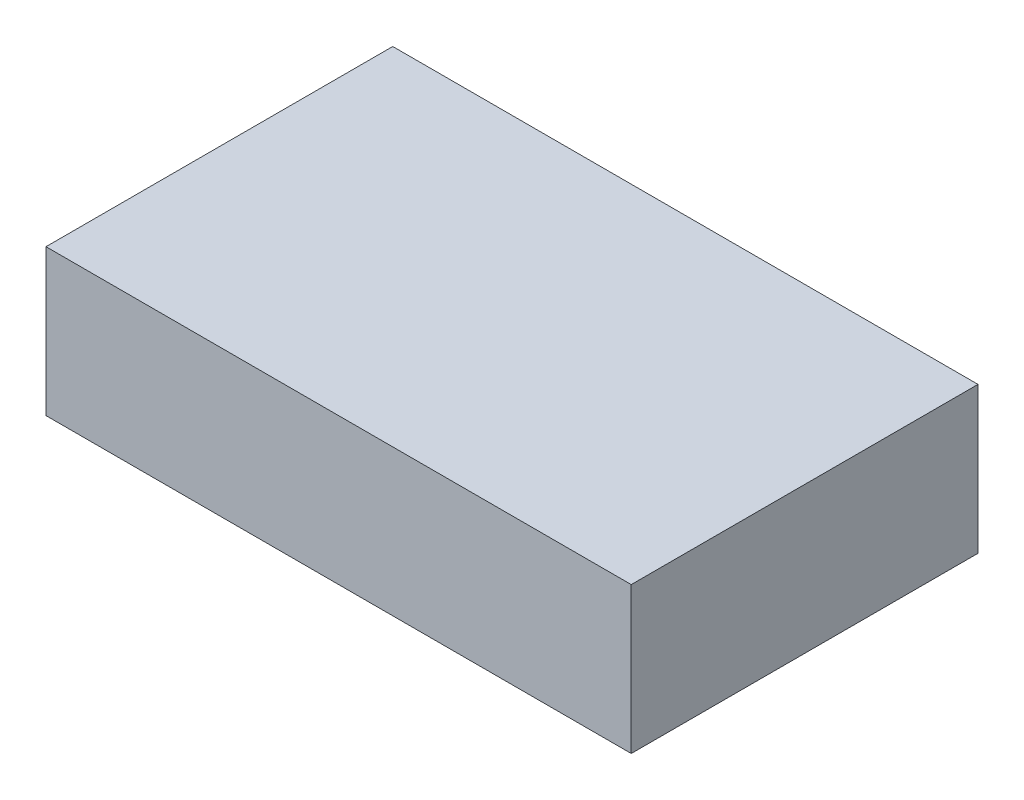
ISO-10303-21;
HEADER;
FILE_DESCRIPTION(('STEP AP214'),'2;1');
FILE_NAME('part.step','',(''),(''),'','','');
FILE_SCHEMA(('AUTOMOTIVE_DESIGN { 1 0 10303 214 1 1 1 1 }'));
ENDSEC;
DATA;
#1=APPLICATION_CONTEXT('core data for automotive mechanical design processes');
#2=APPLICATION_PROTOCOL_DEFINITION('international standard','automotive_design',2000,#1);
#3=PRODUCT_CONTEXT('',#1,'mechanical');
#4=PRODUCT('Part','Part','',(#3));
#5=PRODUCT_RELATED_PRODUCT_CATEGORY('part','',(#4));
#6=PRODUCT_DEFINITION_FORMATION('','',#4);
#7=PRODUCT_DEFINITION_CONTEXT('part definition',#1,'design');
#8=PRODUCT_DEFINITION('design','',#6,#7);
#9=PRODUCT_DEFINITION_SHAPE('','',#8);
#10=(LENGTH_UNIT() NAMED_UNIT(*) SI_UNIT(.MILLI.,.METRE.));
#11=(NAMED_UNIT(*) PLANE_ANGLE_UNIT() SI_UNIT($,.RADIAN.));
#12=(NAMED_UNIT(*) SI_UNIT($,.STERADIAN.) SOLID_ANGLE_UNIT());
#13=UNCERTAINTY_MEASURE_WITH_UNIT(LENGTH_MEASURE(1.E-05),#10,'distance_accuracy_value','');
#14=(GEOMETRIC_REPRESENTATION_CONTEXT(3) GLOBAL_UNCERTAINTY_ASSIGNED_CONTEXT((#13)) GLOBAL_UNIT_ASSIGNED_CONTEXT((#10,
#11,#12)) REPRESENTATION_CONTEXT('',''));
#15=CARTESIAN_POINT('',(0.,0.,0.));
#16=DIRECTION('',(0.,0.,1.));
#17=DIRECTION('',(1.,0.,0.));
#18=AXIS2_PLACEMENT_3D('',#15,#16,#17);
#19=CARTESIAN_POINT('',(0.,-10.,0.));
#20=DIRECTION('',(-1.,0.,0.));
#21=DIRECTION('',(0.,0.,1.));
#22=AXIS2_PLACEMENT_3D('',#19,#20,#21);
#23=PLANE('',#22);
#24=DIRECTION('',(0.,0.,1.));
#25=VECTOR('',#24,1.);
#26=CARTESIAN_POINT('',(0.,0.,0.));
#27=LINE('',#26,#25);
#28=CARTESIAN_POINT('',(0.,0.,-23.7));
#29=VERTEX_POINT('',#28);
#30=CARTESIAN_POINT('',(0.,0.,0.));
#31=VERTEX_POINT('',#30);
#32=EDGE_CURVE('E107',#29,#31,#27,.T.);
#33=ORIENTED_EDGE('',*,*,#32,.F.);
#34=DIRECTION('',(0.,1.,0.));
#35=VECTOR('',#34,1.);
#36=CARTESIAN_POINT('',(0.,-10.,-23.7));
#37=LINE('',#36,#35);
#38=CARTESIAN_POINT('',(0.,-10.,-23.7));
#39=VERTEX_POINT('',#38);
#40=EDGE_CURVE('E11',#39,#29,#37,.T.);
#41=ORIENTED_EDGE('',*,*,#40,.F.);
#42=DIRECTION('',(0.,0.,1.));
#43=VECTOR('',#42,1.);
#44=CARTESIAN_POINT('',(0.,-10.,0.));
#45=LINE('',#44,#43);
#46=CARTESIAN_POINT('',(0.,-10.,0.));
#47=VERTEX_POINT('',#46);
#48=EDGE_CURVE('E102',#39,#47,#45,.T.);
#49=ORIENTED_EDGE('',*,*,#48,.T.);
#50=DIRECTION('',(0.,1.,0.));
#51=VECTOR('',#50,1.);
#52=CARTESIAN_POINT('',(0.,-10.,0.));
#53=LINE('',#52,#51);
#54=EDGE_CURVE('E46',#47,#31,#53,.T.);
#55=ORIENTED_EDGE('',*,*,#54,.T.);
#56=EDGE_LOOP('',(#33,#41,#49,#55));
#57=FACE_BOUND('',#56,.T.);
#58=ADVANCED_FACE('F43',(#57),#23,.T.);
#59=CARTESIAN_POINT('',(0.,-10.,-23.7));
#60=DIRECTION('',(0.,0.,-1.));
#61=DIRECTION('',(-1.,0.,0.));
#62=AXIS2_PLACEMENT_3D('',#59,#60,#61);
#63=PLANE('',#62);
#64=DIRECTION('',(-1.,0.,0.));
#65=VECTOR('',#64,1.);
#66=CARTESIAN_POINT('',(0.,0.,-23.7));
#67=LINE('',#66,#65);
#68=CARTESIAN_POINT('',(40.,0.,-23.7));
#69=VERTEX_POINT('',#68);
#70=EDGE_CURVE('E104',#69,#29,#67,.T.);
#71=ORIENTED_EDGE('',*,*,#70,.F.);
#72=DIRECTION('',(0.,1.,0.));
#73=VECTOR('',#72,1.);
#74=CARTESIAN_POINT('',(40.,-10.,-23.7));
#75=LINE('',#74,#73);
#76=CARTESIAN_POINT('',(40.,-10.,-23.7));
#77=VERTEX_POINT('',#76);
#78=EDGE_CURVE('E55',#77,#69,#75,.T.);
#79=ORIENTED_EDGE('',*,*,#78,.F.);
#80=DIRECTION('',(-1.,0.,0.));
#81=VECTOR('',#80,1.);
#82=CARTESIAN_POINT('',(0.,-10.,-23.7));
#83=LINE('',#82,#81);
#84=EDGE_CURVE('E97',#77,#39,#83,.T.);
#85=ORIENTED_EDGE('',*,*,#84,.T.);
#86=ORIENTED_EDGE('',*,*,#40,.T.);
#87=EDGE_LOOP('',(#71,#79,#85,#86));
#88=FACE_BOUND('',#87,.T.);
#89=ADVANCED_FACE('F117',(#88),#63,.T.);
#90=CARTESIAN_POINT('',(40.,-10.,0.));
#91=DIRECTION('',(1.,0.,0.));
#92=DIRECTION('',(0.,0.,-1.));
#93=AXIS2_PLACEMENT_3D('',#90,#91,#92);
#94=PLANE('',#93);
#95=DIRECTION('',(0.,0.,-1.));
#96=VECTOR('',#95,1.);
#97=CARTESIAN_POINT('',(40.,0.,0.));
#98=LINE('',#97,#96);
#99=CARTESIAN_POINT('',(40.,0.,0.));
#100=VERTEX_POINT('',#99);
#101=EDGE_CURVE('E93',#100,#69,#98,.T.);
#102=ORIENTED_EDGE('',*,*,#101,.F.);
#103=DIRECTION('',(0.,1.,0.));
#104=VECTOR('',#103,1.);
#105=CARTESIAN_POINT('',(40.,-10.,0.));
#106=LINE('',#105,#104);
#107=CARTESIAN_POINT('',(40.,-10.,0.));
#108=VERTEX_POINT('',#107);
#109=EDGE_CURVE('E88',#108,#100,#106,.T.);
#110=ORIENTED_EDGE('',*,*,#109,.F.);
#111=DIRECTION('',(0.,0.,-1.));
#112=VECTOR('',#111,1.);
#113=CARTESIAN_POINT('',(40.,-10.,0.));
#114=LINE('',#113,#112);
#115=EDGE_CURVE('E91',#108,#77,#114,.T.);
#116=ORIENTED_EDGE('',*,*,#115,.T.);
#117=ORIENTED_EDGE('',*,*,#78,.T.);
#118=EDGE_LOOP('',(#102,#110,#116,#117));
#119=FACE_BOUND('',#118,.T.);
#120=ADVANCED_FACE('F89',(#119),#94,.T.);
#121=CARTESIAN_POINT('',(0.,-10.,0.));
#122=DIRECTION('',(0.,0.,1.));
#123=DIRECTION('',(1.,0.,0.));
#124=AXIS2_PLACEMENT_3D('',#121,#122,#123);
#125=PLANE('',#124);
#126=DIRECTION('',(1.,0.,0.));
#127=VECTOR('',#126,1.);
#128=CARTESIAN_POINT('',(0.,0.,0.));
#129=LINE('',#128,#127);
#130=EDGE_CURVE('E110',#31,#100,#129,.T.);
#131=ORIENTED_EDGE('',*,*,#130,.F.);
#132=ORIENTED_EDGE('',*,*,#54,.F.);
#133=DIRECTION('',(1.,0.,0.));
#134=VECTOR('',#133,1.);
#135=CARTESIAN_POINT('',(0.,-10.,0.));
#136=LINE('',#135,#134);
#137=EDGE_CURVE('E100',#47,#108,#136,.T.);
#138=ORIENTED_EDGE('',*,*,#137,.T.);
#139=ORIENTED_EDGE('',*,*,#109,.T.);
#140=EDGE_LOOP('',(#131,#132,#138,#139));
#141=FACE_BOUND('',#140,.T.);
#142=ADVANCED_FACE('F99',(#141),#125,.T.);
#143=CARTESIAN_POINT('',(0.,-10.,0.));
#144=DIRECTION('',(0.,-1.,0.));
#145=DIRECTION('',(0.,0.,-1.));
#146=AXIS2_PLACEMENT_3D('',#143,#144,#145);
#147=PLANE('',#146);
#148=ORIENTED_EDGE('',*,*,#48,.F.);
#149=ORIENTED_EDGE('',*,*,#84,.F.);
#150=ORIENTED_EDGE('',*,*,#115,.F.);
#151=ORIENTED_EDGE('',*,*,#137,.F.);
#152=EDGE_LOOP('',(#148,#149,#150,#151));
#153=FACE_BOUND('',#152,.T.);
#154=ADVANCED_FACE('F96',(#153),#147,.T.);
#155=CARTESIAN_POINT('',(0.,0.,0.));
#156=DIRECTION('',(0.,-1.,0.));
#157=DIRECTION('',(0.,0.,-1.));
#158=AXIS2_PLACEMENT_3D('',#155,#156,#157);
#159=PLANE('',#158);
#160=ORIENTED_EDGE('',*,*,#32,.T.);
#161=ORIENTED_EDGE('',*,*,#130,.T.);
#162=ORIENTED_EDGE('',*,*,#101,.T.);
#163=ORIENTED_EDGE('',*,*,#70,.T.);
#164=EDGE_LOOP('',(#160,#161,#162,#163));
#165=FACE_BOUND('',#164,.T.);
#166=ADVANCED_FACE('F116',(#165),#159,.F.);
#167=CLOSED_SHELL('',(#58,#89,#120,#142,#154,#166));
#168=MANIFOLD_SOLID_BREP('B2',#167);
#169=ADVANCED_BREP_SHAPE_REPRESENTATION('',(#18,#168),#14);
#170=SHAPE_DEFINITION_REPRESENTATION(#9,#169);
ENDSEC;
END-ISO-10303-21;
